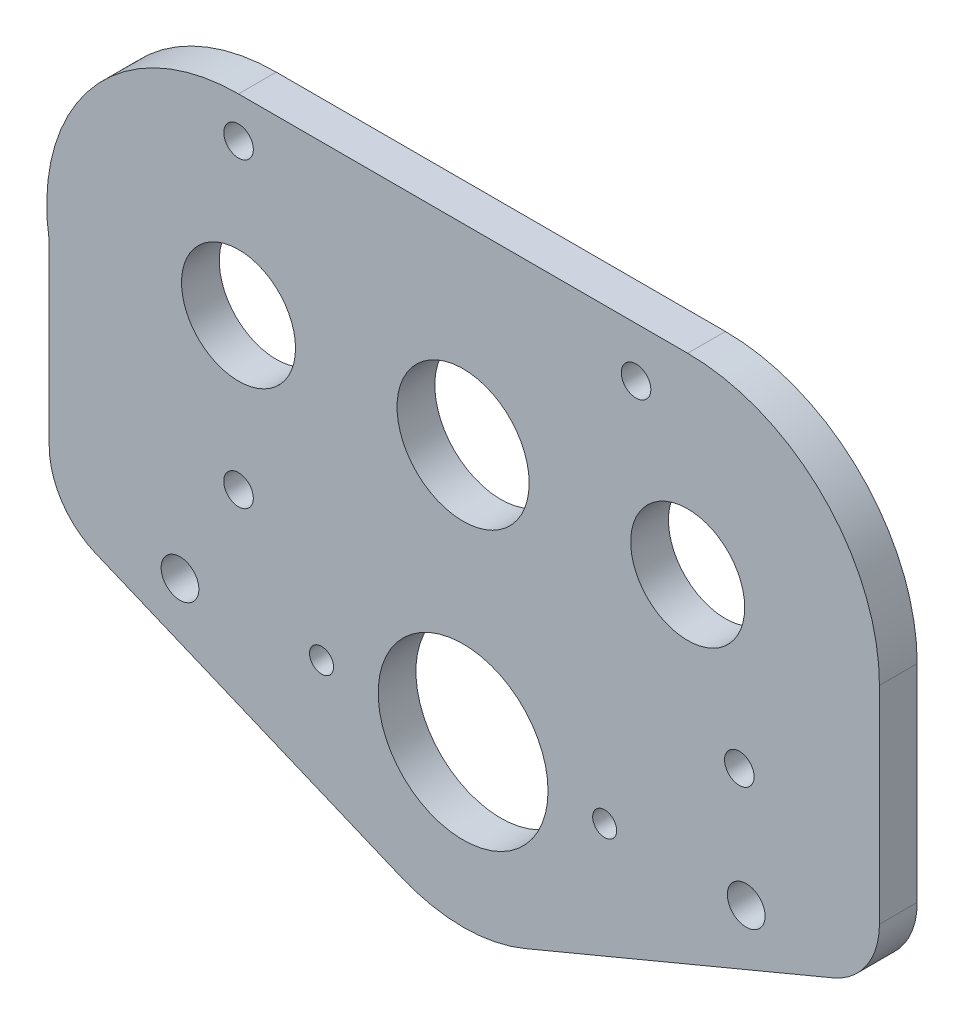
ISO-10303-21;
HEADER;
FILE_DESCRIPTION(('STEP AP214'),'2;1');
FILE_NAME('part.step','',(''),(''),'','','');
FILE_SCHEMA(('AUTOMOTIVE_DESIGN { 1 0 10303 214 1 1 1 1 }'));
ENDSEC;
DATA;
#1=APPLICATION_CONTEXT('core data for automotive mechanical design processes');
#2=APPLICATION_PROTOCOL_DEFINITION('international standard','automotive_design',2000,#1);
#3=PRODUCT_CONTEXT('',#1,'mechanical');
#4=PRODUCT('Part','Part','',(#3));
#5=PRODUCT_RELATED_PRODUCT_CATEGORY('part','',(#4));
#6=PRODUCT_DEFINITION_FORMATION('','',#4);
#7=PRODUCT_DEFINITION_CONTEXT('part definition',#1,'design');
#8=PRODUCT_DEFINITION('design','',#6,#7);
#9=PRODUCT_DEFINITION_SHAPE('','',#8);
#10=(LENGTH_UNIT() NAMED_UNIT(*) SI_UNIT(.MILLI.,.METRE.));
#11=(NAMED_UNIT(*) PLANE_ANGLE_UNIT() SI_UNIT($,.RADIAN.));
#12=(NAMED_UNIT(*) SI_UNIT($,.STERADIAN.) SOLID_ANGLE_UNIT());
#13=UNCERTAINTY_MEASURE_WITH_UNIT(LENGTH_MEASURE(1.E-05),#10,'distance_accuracy_value','');
#14=(GEOMETRIC_REPRESENTATION_CONTEXT(3) GLOBAL_UNCERTAINTY_ASSIGNED_CONTEXT((#13)) GLOBAL_UNIT_ASSIGNED_CONTEXT((#10,
#11,#12)) REPRESENTATION_CONTEXT('',''));
#15=CARTESIAN_POINT('',(0.,0.,0.));
#16=DIRECTION('',(0.,0.,1.));
#17=DIRECTION('',(1.,0.,0.));
#18=AXIS2_PLACEMENT_3D('',#15,#16,#17);
#19=CARTESIAN_POINT('',(-37.7793249999999,43.2562,3.175));
#20=DIRECTION('',(0.,0.,-1.));
#21=DIRECTION('',(-1.,0.,0.));
#22=AXIS2_PLACEMENT_3D('',#19,#20,#21);
#23=PLANE('',#22);
#24=CARTESIAN_POINT('',(46.4666366404921,19.3880074320415,3.175));
#25=DIRECTION('',(0.,0.,1.));
#26=DIRECTION('',(1.,0.,0.));
#27=AXIS2_PLACEMENT_3D('',#24,#25,#26);
#28=CIRCLE('',#27,2.4892);
#29=CARTESIAN_POINT('',(48.9558366404922,19.3880074320415,3.175));
#30=VERTEX_POINT('',#29);
#31=EDGE_CURVE('E266',#30,#30,#28,.T.);
#32=ORIENTED_EDGE('',*,*,#31,.F.);
#33=EDGE_LOOP('',(#32));
#34=FACE_BOUND('',#33,.T.);
#35=CARTESIAN_POINT('',(-37.7793249999999,68.6562,3.175));
#36=DIRECTION('',(0.,0.,1.));
#37=DIRECTION('',(1.,0.,0.));
#38=AXIS2_PLACEMENT_3D('',#35,#36,#37);
#39=CIRCLE('',#38,2.4892);
#40=CARTESIAN_POINT('',(-35.2901249999999,68.6562,3.175));
#41=VERTEX_POINT('',#40);
#42=EDGE_CURVE('E254',#41,#41,#39,.T.);
#43=ORIENTED_EDGE('',*,*,#42,.F.);
#44=EDGE_LOOP('',(#43));
#45=FACE_BOUND('',#44,.T.);
#46=CARTESIAN_POINT('',(-23.8125,0.,3.175));
#47=DIRECTION('',(0.,0.,1.));
#48=DIRECTION('',(1.,0.,0.));
#49=AXIS2_PLACEMENT_3D('',#46,#47,#48);
#50=CIRCLE('',#49,2.0193);
#51=CARTESIAN_POINT('',(-21.7932,0.,3.175));
#52=VERTEX_POINT('',#51);
#53=EDGE_CURVE('E242',#52,#52,#50,.T.);
#54=ORIENTED_EDGE('',*,*,#53,.F.);
#55=EDGE_LOOP('',(#54));
#56=FACE_BOUND('',#55,.T.);
#57=CARTESIAN_POINT('',(-47.625,0.,3.175));
#58=DIRECTION('',(0.,0.,1.));
#59=DIRECTION('',(1.,0.,0.));
#60=AXIS2_PLACEMENT_3D('',#57,#58,#59);
#61=CIRCLE('',#60,3.175);
#62=CARTESIAN_POINT('',(-44.45,0.,3.175));
#63=VERTEX_POINT('',#62);
#64=EDGE_CURVE('E230',#63,#63,#61,.T.);
#65=ORIENTED_EDGE('',*,*,#64,.F.);
#66=EDGE_LOOP('',(#65));
#67=FACE_BOUND('',#66,.T.);
#68=CARTESIAN_POINT('',(37.779325,43.2562,3.175));
#69=DIRECTION('',(0.,0.,1.));
#70=DIRECTION('',(1.,0.,0.));
#71=AXIS2_PLACEMENT_3D('',#68,#69,#70);
#72=CIRCLE('',#71,9.5885);
#73=CARTESIAN_POINT('',(47.367825,43.2562,3.175));
#74=VERTEX_POINT('',#73);
#75=EDGE_CURVE('E218',#74,#74,#72,.T.);
#76=ORIENTED_EDGE('',*,*,#75,.F.);
#77=EDGE_LOOP('',(#76));
#78=FACE_BOUND('',#77,.T.);
#79=CARTESIAN_POINT('',(0.,0.,3.175));
#80=DIRECTION('',(0.,0.,1.));
#81=DIRECTION('',(1.,0.,0.));
#82=AXIS2_PLACEMENT_3D('',#79,#80,#81);
#83=CIRCLE('',#82,14.2875);
#84=CARTESIAN_POINT('',(14.2875,0.,3.175));
#85=VERTEX_POINT('',#84);
#86=EDGE_CURVE('E146',#85,#85,#83,.T.);
#87=ORIENTED_EDGE('',*,*,#86,.F.);
#88=EDGE_LOOP('',(#87));
#89=FACE_BOUND('',#88,.T.);
#90=CARTESIAN_POINT('',(-37.7793249999999,43.2562,3.175));
#91=DIRECTION('',(0.,0.,1.));
#92=DIRECTION('',(-1.,0.,0.));
#93=AXIS2_PLACEMENT_3D('',#90,#91,#92);
#94=CIRCLE('',#93,32.258);
#95=CARTESIAN_POINT('',(-37.779325,75.5142,3.175));
#96=VERTEX_POINT('',#95);
#97=CARTESIAN_POINT('',(-69.6225686406845,38.1,3.175));
#98=VERTEX_POINT('',#97);
#99=EDGE_CURVE('E161',#96,#98,#94,.T.);
#100=ORIENTED_EDGE('',*,*,#99,.T.);
#101=DIRECTION('',(0.,-1.,0.));
#102=VECTOR('',#101,1.);
#103=CARTESIAN_POINT('',(-69.6225686406845,38.1,3.175));
#104=LINE('',#103,#102);
#105=CARTESIAN_POINT('',(-69.6225686406845,8.2865313172234,3.175));
#106=VERTEX_POINT('',#105);
#107=EDGE_CURVE('E99',#98,#106,#104,.T.);
#108=ORIENTED_EDGE('',*,*,#107,.T.);
#109=CARTESIAN_POINT('',(-56.9225686406845,8.28653131722333,3.175));
#110=DIRECTION('',(0.,0.,1.));
#111=DIRECTION('',(-1.,0.,0.));
#112=AXIS2_PLACEMENT_3D('',#109,#110,#111);
#113=CIRCLE('',#112,12.7);
#114=CARTESIAN_POINT('',(-61.8162937970207,-3.43274571227991,3.175));
#115=VERTEX_POINT('',#114);
#116=EDGE_CURVE('E182',#106,#115,#113,.T.);
#117=ORIENTED_EDGE('',*,*,#116,.T.);
#118=DIRECTION('',(0.922777718858521,-0.385332689475295,0.));
#119=VECTOR('',#118,1.);
#120=CARTESIAN_POINT('',(-61.8162937970207,-3.43274571227991,3.175));
#121=LINE('',#120,#119);
#122=CARTESIAN_POINT('',(-10.3991659572145,-24.9034636876944,3.175));
#123=VERTEX_POINT('',#122);
#124=EDGE_CURVE('E201',#115,#123,#121,.T.);
#125=ORIENTED_EDGE('',*,*,#124,.T.);
#126=CARTESIAN_POINT('',(0.,1.42247325030098E-13,3.175));
#127=DIRECTION('',(0.,0.,1.));
#128=DIRECTION('',(1.,0.,0.));
#129=AXIS2_PLACEMENT_3D('',#126,#127,#128);
#130=CIRCLE('',#129,26.9875000000001);
#131=CARTESIAN_POINT('',(10.3990857480341,-24.9034971812199,3.175));
#132=VERTEX_POINT('',#131);
#133=EDGE_CURVE('E198',#123,#132,#130,.T.);
#134=ORIENTED_EDGE('',*,*,#133,.T.);
#135=DIRECTION('',(0.922778959934044,0.385329717388946,0.));
#136=VECTOR('',#135,1.);
#137=CARTESIAN_POINT('',(62.2310124108396,-3.25976393644494,3.175));
#138=LINE('',#137,#136);
#139=CARTESIAN_POINT('',(62.2310124108396,-3.25976393644495,3.175));
#140=VERTEX_POINT('',#139);
#141=EDGE_CURVE('E200',#132,#140,#138,.T.);
#142=ORIENTED_EDGE('',*,*,#141,.T.);
#143=CARTESIAN_POINT('',(57.337325,8.45952885471743,3.175));
#144=DIRECTION('',(0.,0.,1.));
#145=DIRECTION('',(-1.,0.,0.));
#146=AXIS2_PLACEMENT_3D('',#143,#144,#145);
#147=CIRCLE('',#146,12.7);
#148=CARTESIAN_POINT('',(70.037325,8.45952885471751,3.175));
#149=VERTEX_POINT('',#148);
#150=EDGE_CURVE('E124',#140,#149,#147,.T.);
#151=ORIENTED_EDGE('',*,*,#150,.T.);
#152=DIRECTION('',(0.,1.,0.));
#153=VECTOR('',#152,1.);
#154=CARTESIAN_POINT('',(70.037325,43.2562,3.175));
#155=LINE('',#154,#153);
#156=CARTESIAN_POINT('',(70.037325,43.2562,3.175));
#157=VERTEX_POINT('',#156);
#158=EDGE_CURVE('E118',#149,#157,#155,.T.);
#159=ORIENTED_EDGE('',*,*,#158,.T.);
#160=CARTESIAN_POINT('',(37.779325,43.2562,3.175));
#161=DIRECTION('',(0.,0.,1.));
#162=DIRECTION('',(-1.,0.,0.));
#163=AXIS2_PLACEMENT_3D('',#160,#161,#162);
#164=CIRCLE('',#163,32.258);
#165=CARTESIAN_POINT('',(37.779325,75.5142,3.175));
#166=VERTEX_POINT('',#165);
#167=EDGE_CURVE('E122',#157,#166,#164,.T.);
#168=ORIENTED_EDGE('',*,*,#167,.T.);
#169=DIRECTION('',(-1.,0.,0.));
#170=VECTOR('',#169,1.);
#171=CARTESIAN_POINT('',(-37.779325,75.5142,3.175));
#172=LINE('',#171,#170);
#173=EDGE_CURVE('E50',#166,#96,#172,.T.);
#174=ORIENTED_EDGE('',*,*,#173,.T.);
#175=EDGE_LOOP('',(#100,#108,#117,#125,#134,#142,#151,#159,#168,#174));
#176=FACE_BOUND('',#175,.T.);
#177=CARTESIAN_POINT('',(-37.779325,43.2562,3.175));
#178=DIRECTION('',(0.,0.,1.));
#179=DIRECTION('',(1.,0.,0.));
#180=AXIS2_PLACEMENT_3D('',#177,#178,#179);
#181=CIRCLE('',#180,9.5885);
#182=CARTESIAN_POINT('',(-28.190825,43.2562,3.175));
#183=VERTEX_POINT('',#182);
#184=EDGE_CURVE('E212',#183,#183,#181,.T.);
#185=ORIENTED_EDGE('',*,*,#184,.F.);
#186=EDGE_LOOP('',(#185));
#187=FACE_BOUND('',#186,.T.);
#188=CARTESIAN_POINT('',(0.,43.2562,3.175));
#189=DIRECTION('',(0.,0.,1.));
#190=DIRECTION('',(1.,0.,0.));
#191=AXIS2_PLACEMENT_3D('',#188,#189,#190);
#192=CIRCLE('',#191,11.1125);
#193=CARTESIAN_POINT('',(11.1125,43.2562,3.175));
#194=VERTEX_POINT('',#193);
#195=EDGE_CURVE('E224',#194,#194,#192,.T.);
#196=ORIENTED_EDGE('',*,*,#195,.F.);
#197=EDGE_LOOP('',(#196));
#198=FACE_BOUND('',#197,.T.);
#199=CARTESIAN_POINT('',(47.625,0.,3.175));
#200=DIRECTION('',(0.,0.,1.));
#201=DIRECTION('',(1.,0.,0.));
#202=AXIS2_PLACEMENT_3D('',#199,#200,#201);
#203=CIRCLE('',#202,3.175);
#204=CARTESIAN_POINT('',(50.8,0.,3.175));
#205=VERTEX_POINT('',#204);
#206=EDGE_CURVE('E236',#205,#205,#203,.T.);
#207=ORIENTED_EDGE('',*,*,#206,.F.);
#208=EDGE_LOOP('',(#207));
#209=FACE_BOUND('',#208,.T.);
#210=CARTESIAN_POINT('',(23.8125,0.,3.175));
#211=DIRECTION('',(0.,0.,1.));
#212=DIRECTION('',(1.,0.,0.));
#213=AXIS2_PLACEMENT_3D('',#210,#211,#212);
#214=CIRCLE('',#213,2.0193);
#215=CARTESIAN_POINT('',(25.8318,0.,3.175));
#216=VERTEX_POINT('',#215);
#217=EDGE_CURVE('E248',#216,#216,#214,.T.);
#218=ORIENTED_EDGE('',*,*,#217,.F.);
#219=EDGE_LOOP('',(#218));
#220=FACE_BOUND('',#219,.T.);
#221=CARTESIAN_POINT('',(-37.7793249999999,17.8562,3.175));
#222=DIRECTION('',(0.,0.,1.));
#223=DIRECTION('',(1.,0.,0.));
#224=AXIS2_PLACEMENT_3D('',#221,#222,#223);
#225=CIRCLE('',#224,2.4892);
#226=CARTESIAN_POINT('',(-35.2901249999999,17.8562,3.175));
#227=VERTEX_POINT('',#226);
#228=EDGE_CURVE('E260',#227,#227,#225,.T.);
#229=ORIENTED_EDGE('',*,*,#228,.F.);
#230=EDGE_LOOP('',(#229));
#231=FACE_BOUND('',#230,.T.);
#232=CARTESIAN_POINT('',(29.0920133595289,67.1243925679586,3.175));
#233=DIRECTION('',(0.,0.,1.));
#234=DIRECTION('',(1.,0.,0.));
#235=AXIS2_PLACEMENT_3D('',#232,#233,#234);
#236=CIRCLE('',#235,2.4892);
#237=CARTESIAN_POINT('',(31.5812133595289,67.1243925679586,3.175));
#238=VERTEX_POINT('',#237);
#239=EDGE_CURVE('E272',#238,#238,#236,.T.);
#240=ORIENTED_EDGE('',*,*,#239,.F.);
#241=EDGE_LOOP('',(#240));
#242=FACE_BOUND('',#241,.T.);
#243=ADVANCED_FACE('F33',(#34,#45,#56,#67,#78,#89,#176,#187,#198,#209,#220,#231,#242),#23,.F.);
#244=CARTESIAN_POINT('',(-37.7793249999999,43.2562,-3.175));
#245=DIRECTION('',(0.,0.,-1.));
#246=DIRECTION('',(-1.,0.,0.));
#247=AXIS2_PLACEMENT_3D('',#244,#245,#246);
#248=PLANE('',#247);
#249=CARTESIAN_POINT('',(46.4666366404921,19.3880074320415,-3.175));
#250=DIRECTION('',(0.,0.,1.));
#251=DIRECTION('',(1.,0.,0.));
#252=AXIS2_PLACEMENT_3D('',#249,#250,#251);
#253=CIRCLE('',#252,2.4892);
#254=CARTESIAN_POINT('',(48.9558366404922,19.3880074320415,-3.175));
#255=VERTEX_POINT('',#254);
#256=EDGE_CURVE('E269',#255,#255,#253,.T.);
#257=ORIENTED_EDGE('',*,*,#256,.T.);
#258=EDGE_LOOP('',(#257));
#259=FACE_BOUND('',#258,.T.);
#260=CARTESIAN_POINT('',(-37.7793249999999,68.6562,-3.175));
#261=DIRECTION('',(0.,0.,1.));
#262=DIRECTION('',(1.,0.,0.));
#263=AXIS2_PLACEMENT_3D('',#260,#261,#262);
#264=CIRCLE('',#263,2.4892);
#265=CARTESIAN_POINT('',(-35.2901249999999,68.6562,-3.175));
#266=VERTEX_POINT('',#265);
#267=EDGE_CURVE('E257',#266,#266,#264,.T.);
#268=ORIENTED_EDGE('',*,*,#267,.T.);
#269=EDGE_LOOP('',(#268));
#270=FACE_BOUND('',#269,.T.);
#271=CARTESIAN_POINT('',(-23.8125,0.,-3.175));
#272=DIRECTION('',(0.,0.,1.));
#273=DIRECTION('',(1.,0.,0.));
#274=AXIS2_PLACEMENT_3D('',#271,#272,#273);
#275=CIRCLE('',#274,2.0193);
#276=CARTESIAN_POINT('',(-21.7932,0.,-3.175));
#277=VERTEX_POINT('',#276);
#278=EDGE_CURVE('E245',#277,#277,#275,.T.);
#279=ORIENTED_EDGE('',*,*,#278,.T.);
#280=EDGE_LOOP('',(#279));
#281=FACE_BOUND('',#280,.T.);
#282=CARTESIAN_POINT('',(-47.625,0.,-3.175));
#283=DIRECTION('',(0.,0.,1.));
#284=DIRECTION('',(1.,0.,0.));
#285=AXIS2_PLACEMENT_3D('',#282,#283,#284);
#286=CIRCLE('',#285,3.175);
#287=CARTESIAN_POINT('',(-44.45,0.,-3.175));
#288=VERTEX_POINT('',#287);
#289=EDGE_CURVE('E233',#288,#288,#286,.T.);
#290=ORIENTED_EDGE('',*,*,#289,.T.);
#291=EDGE_LOOP('',(#290));
#292=FACE_BOUND('',#291,.T.);
#293=CARTESIAN_POINT('',(37.779325,43.2562,-3.175));
#294=DIRECTION('',(0.,0.,1.));
#295=DIRECTION('',(1.,0.,0.));
#296=AXIS2_PLACEMENT_3D('',#293,#294,#295);
#297=CIRCLE('',#296,9.5885);
#298=CARTESIAN_POINT('',(47.367825,43.2562,-3.175));
#299=VERTEX_POINT('',#298);
#300=EDGE_CURVE('E221',#299,#299,#297,.T.);
#301=ORIENTED_EDGE('',*,*,#300,.T.);
#302=EDGE_LOOP('',(#301));
#303=FACE_BOUND('',#302,.T.);
#304=CARTESIAN_POINT('',(0.,0.,-3.175));
#305=DIRECTION('',(0.,0.,1.));
#306=DIRECTION('',(1.,0.,0.));
#307=AXIS2_PLACEMENT_3D('',#304,#305,#306);
#308=CIRCLE('',#307,14.2875);
#309=CARTESIAN_POINT('',(14.2875,0.,-3.175));
#310=VERTEX_POINT('',#309);
#311=EDGE_CURVE('E209',#310,#310,#308,.T.);
#312=ORIENTED_EDGE('',*,*,#311,.T.);
#313=EDGE_LOOP('',(#312));
#314=FACE_BOUND('',#313,.T.);
#315=CARTESIAN_POINT('',(-37.7793249999999,43.2562,-3.175));
#316=DIRECTION('',(0.,0.,1.));
#317=DIRECTION('',(-1.,0.,0.));
#318=AXIS2_PLACEMENT_3D('',#315,#316,#317);
#319=CIRCLE('',#318,32.258);
#320=CARTESIAN_POINT('',(-37.779325,75.5142,-3.175));
#321=VERTEX_POINT('',#320);
#322=CARTESIAN_POINT('',(-69.6225686406845,38.1,-3.175));
#323=VERTEX_POINT('',#322);
#324=EDGE_CURVE('E142',#321,#323,#319,.T.);
#325=ORIENTED_EDGE('',*,*,#324,.F.);
#326=DIRECTION('',(-1.,0.,0.));
#327=VECTOR('',#326,1.);
#328=CARTESIAN_POINT('',(-37.779325,75.5142,-3.175));
#329=LINE('',#328,#327);
#330=CARTESIAN_POINT('',(37.779325,75.5142,-3.175));
#331=VERTEX_POINT('',#330);
#332=EDGE_CURVE('E91',#331,#321,#329,.T.);
#333=ORIENTED_EDGE('',*,*,#332,.F.);
#334=CARTESIAN_POINT('',(37.779325,43.2562,-3.175));
#335=DIRECTION('',(0.,0.,1.));
#336=DIRECTION('',(-1.,0.,0.));
#337=AXIS2_PLACEMENT_3D('',#334,#335,#336);
#338=CIRCLE('',#337,32.258);
#339=CARTESIAN_POINT('',(70.037325,43.2562,-3.175));
#340=VERTEX_POINT('',#339);
#341=EDGE_CURVE('E85',#340,#331,#338,.T.);
#342=ORIENTED_EDGE('',*,*,#341,.F.);
#343=DIRECTION('',(0.,1.,0.));
#344=VECTOR('',#343,1.);
#345=CARTESIAN_POINT('',(70.037325,43.2562,-3.175));
#346=LINE('',#345,#344);
#347=CARTESIAN_POINT('',(70.037325,8.45952885471751,-3.175));
#348=VERTEX_POINT('',#347);
#349=EDGE_CURVE('E132',#348,#340,#346,.T.);
#350=ORIENTED_EDGE('',*,*,#349,.F.);
#351=CARTESIAN_POINT('',(57.337325,8.45952885471743,-3.175));
#352=DIRECTION('',(0.,0.,1.));
#353=DIRECTION('',(-1.,0.,0.));
#354=AXIS2_PLACEMENT_3D('',#351,#352,#353);
#355=CIRCLE('',#354,12.7);
#356=CARTESIAN_POINT('',(62.2310124108396,-3.25976393644495,-3.175));
#357=VERTEX_POINT('',#356);
#358=EDGE_CURVE('E156',#357,#348,#355,.T.);
#359=ORIENTED_EDGE('',*,*,#358,.F.);
#360=DIRECTION('',(0.922778959934044,0.385329717388946,0.));
#361=VECTOR('',#360,1.);
#362=CARTESIAN_POINT('',(62.2310124108396,-3.25976393644494,-3.175));
#363=LINE('',#362,#361);
#364=CARTESIAN_POINT('',(10.3990857480341,-24.9034971812199,-3.175));
#365=VERTEX_POINT('',#364);
#366=EDGE_CURVE('E154',#365,#357,#363,.T.);
#367=ORIENTED_EDGE('',*,*,#366,.F.);
#368=CARTESIAN_POINT('',(0.,1.42247325030098E-13,-3.175));
#369=DIRECTION('',(0.,0.,1.));
#370=DIRECTION('',(1.,0.,0.));
#371=AXIS2_PLACEMENT_3D('',#368,#369,#370);
#372=CIRCLE('',#371,26.9875000000001);
#373=CARTESIAN_POINT('',(-10.3991659572145,-24.9034636876944,-3.175));
#374=VERTEX_POINT('',#373);
#375=EDGE_CURVE('E152',#374,#365,#372,.T.);
#376=ORIENTED_EDGE('',*,*,#375,.F.);
#377=DIRECTION('',(0.922777718858521,-0.385332689475295,0.));
#378=VECTOR('',#377,1.);
#379=CARTESIAN_POINT('',(-61.8162937970207,-3.43274571227991,-3.175));
#380=LINE('',#379,#378);
#381=CARTESIAN_POINT('',(-61.8162937970207,-3.43274571227991,-3.175));
#382=VERTEX_POINT('',#381);
#383=EDGE_CURVE('E150',#382,#374,#380,.T.);
#384=ORIENTED_EDGE('',*,*,#383,.F.);
#385=CARTESIAN_POINT('',(-56.9225686406845,8.28653131722333,-3.175));
#386=DIRECTION('',(0.,0.,1.));
#387=DIRECTION('',(-1.,0.,0.));
#388=AXIS2_PLACEMENT_3D('',#385,#386,#387);
#389=CIRCLE('',#388,12.7);
#390=CARTESIAN_POINT('',(-69.6225686406845,8.2865313172234,-3.175));
#391=VERTEX_POINT('',#390);
#392=EDGE_CURVE('E148',#391,#382,#389,.T.);
#393=ORIENTED_EDGE('',*,*,#392,.F.);
#394=DIRECTION('',(0.,-1.,0.));
#395=VECTOR('',#394,1.);
#396=CARTESIAN_POINT('',(-69.6225686406845,38.1,-3.175));
#397=LINE('',#396,#395);
#398=EDGE_CURVE('E145',#323,#391,#397,.T.);
#399=ORIENTED_EDGE('',*,*,#398,.F.);
#400=EDGE_LOOP('',(#325,#333,#342,#350,#359,#367,#376,#384,#393,#399));
#401=FACE_BOUND('',#400,.T.);
#402=CARTESIAN_POINT('',(-37.779325,43.2562,-3.175));
#403=DIRECTION('',(0.,0.,1.));
#404=DIRECTION('',(1.,0.,0.));
#405=AXIS2_PLACEMENT_3D('',#402,#403,#404);
#406=CIRCLE('',#405,9.5885);
#407=CARTESIAN_POINT('',(-28.190825,43.2562,-3.175));
#408=VERTEX_POINT('',#407);
#409=EDGE_CURVE('E215',#408,#408,#406,.T.);
#410=ORIENTED_EDGE('',*,*,#409,.T.);
#411=EDGE_LOOP('',(#410));
#412=FACE_BOUND('',#411,.T.);
#413=CARTESIAN_POINT('',(0.,43.2562,-3.175));
#414=DIRECTION('',(0.,0.,1.));
#415=DIRECTION('',(1.,0.,0.));
#416=AXIS2_PLACEMENT_3D('',#413,#414,#415);
#417=CIRCLE('',#416,11.1125);
#418=CARTESIAN_POINT('',(11.1125,43.2562,-3.175));
#419=VERTEX_POINT('',#418);
#420=EDGE_CURVE('E227',#419,#419,#417,.T.);
#421=ORIENTED_EDGE('',*,*,#420,.T.);
#422=EDGE_LOOP('',(#421));
#423=FACE_BOUND('',#422,.T.);
#424=CARTESIAN_POINT('',(47.625,0.,-3.175));
#425=DIRECTION('',(0.,0.,1.));
#426=DIRECTION('',(1.,0.,0.));
#427=AXIS2_PLACEMENT_3D('',#424,#425,#426);
#428=CIRCLE('',#427,3.175);
#429=CARTESIAN_POINT('',(50.8,0.,-3.175));
#430=VERTEX_POINT('',#429);
#431=EDGE_CURVE('E239',#430,#430,#428,.T.);
#432=ORIENTED_EDGE('',*,*,#431,.T.);
#433=EDGE_LOOP('',(#432));
#434=FACE_BOUND('',#433,.T.);
#435=CARTESIAN_POINT('',(23.8125,0.,-3.175));
#436=DIRECTION('',(0.,0.,1.));
#437=DIRECTION('',(1.,0.,0.));
#438=AXIS2_PLACEMENT_3D('',#435,#436,#437);
#439=CIRCLE('',#438,2.0193);
#440=CARTESIAN_POINT('',(25.8318,0.,-3.175));
#441=VERTEX_POINT('',#440);
#442=EDGE_CURVE('E251',#441,#441,#439,.T.);
#443=ORIENTED_EDGE('',*,*,#442,.T.);
#444=EDGE_LOOP('',(#443));
#445=FACE_BOUND('',#444,.T.);
#446=CARTESIAN_POINT('',(-37.7793249999999,17.8562,-3.175));
#447=DIRECTION('',(0.,0.,1.));
#448=DIRECTION('',(1.,0.,0.));
#449=AXIS2_PLACEMENT_3D('',#446,#447,#448);
#450=CIRCLE('',#449,2.4892);
#451=CARTESIAN_POINT('',(-35.2901249999999,17.8562,-3.175));
#452=VERTEX_POINT('',#451);
#453=EDGE_CURVE('E263',#452,#452,#450,.T.);
#454=ORIENTED_EDGE('',*,*,#453,.T.);
#455=EDGE_LOOP('',(#454));
#456=FACE_BOUND('',#455,.T.);
#457=CARTESIAN_POINT('',(29.0920133595289,67.1243925679586,-3.175));
#458=DIRECTION('',(0.,0.,1.));
#459=DIRECTION('',(1.,0.,0.));
#460=AXIS2_PLACEMENT_3D('',#457,#458,#459);
#461=CIRCLE('',#460,2.4892);
#462=CARTESIAN_POINT('',(31.5812133595289,67.1243925679586,-3.175));
#463=VERTEX_POINT('',#462);
#464=EDGE_CURVE('E275',#463,#463,#461,.T.);
#465=ORIENTED_EDGE('',*,*,#464,.T.);
#466=EDGE_LOOP('',(#465));
#467=FACE_BOUND('',#466,.T.);
#468=ADVANCED_FACE('F186',(#259,#270,#281,#292,#303,#314,#401,#412,#423,#434,#445,#456,#467),
#248,.T.);
#469=CARTESIAN_POINT('',(-37.7793249999999,43.2562,3.175));
#470=DIRECTION('',(0.,0.,-1.));
#471=DIRECTION('',(-1.,0.,0.));
#472=AXIS2_PLACEMENT_3D('',#469,#470,#471);
#473=CYLINDRICAL_SURFACE('',#472,32.258);
#474=ORIENTED_EDGE('',*,*,#324,.T.);
#475=DIRECTION('',(0.,0.,-1.));
#476=VECTOR('',#475,1.);
#477=CARTESIAN_POINT('',(-69.6225686406845,38.1,3.175));
#478=LINE('',#477,#476);
#479=EDGE_CURVE('E11',#98,#323,#478,.T.);
#480=ORIENTED_EDGE('',*,*,#479,.F.);
#481=ORIENTED_EDGE('',*,*,#99,.F.);
#482=DIRECTION('',(0.,0.,-1.));
#483=VECTOR('',#482,1.);
#484=CARTESIAN_POINT('',(-37.779325,75.5142,3.175));
#485=LINE('',#484,#483);
#486=EDGE_CURVE('E138',#96,#321,#485,.T.);
#487=ORIENTED_EDGE('',*,*,#486,.T.);
#488=EDGE_LOOP('',(#474,#480,#481,#487));
#489=FACE_BOUND('',#488,.T.);
#490=ADVANCED_FACE('F35',(#489),#473,.T.);
#491=CARTESIAN_POINT('',(-69.6225686406845,38.1,3.175));
#492=DIRECTION('',(1.,0.,0.));
#493=DIRECTION('',(0.,0.,-1.));
#494=AXIS2_PLACEMENT_3D('',#491,#492,#493);
#495=PLANE('',#494);
#496=ORIENTED_EDGE('',*,*,#398,.T.);
#497=DIRECTION('',(0.,0.,-1.));
#498=VECTOR('',#497,1.);
#499=CARTESIAN_POINT('',(-69.6225686406845,8.2865313172234,3.175));
#500=LINE('',#499,#498);
#501=EDGE_CURVE('E42',#106,#391,#500,.T.);
#502=ORIENTED_EDGE('',*,*,#501,.F.);
#503=ORIENTED_EDGE('',*,*,#107,.F.);
#504=ORIENTED_EDGE('',*,*,#479,.T.);
#505=EDGE_LOOP('',(#496,#502,#503,#504));
#506=FACE_BOUND('',#505,.T.);
#507=ADVANCED_FACE('F318',(#506),#495,.F.);
#508=CARTESIAN_POINT('',(-56.9225686406845,8.28653131722333,3.175));
#509=DIRECTION('',(0.,0.,-1.));
#510=DIRECTION('',(-1.,0.,0.));
#511=AXIS2_PLACEMENT_3D('',#508,#509,#510);
#512=CYLINDRICAL_SURFACE('',#511,12.7);
#513=ORIENTED_EDGE('',*,*,#392,.T.);
#514=DIRECTION('',(0.,0.,-1.));
#515=VECTOR('',#514,1.);
#516=CARTESIAN_POINT('',(-61.8162937970207,-3.43274571227991,3.175));
#517=LINE('',#516,#515);
#518=EDGE_CURVE('E174',#115,#382,#517,.T.);
#519=ORIENTED_EDGE('',*,*,#518,.F.);
#520=ORIENTED_EDGE('',*,*,#116,.F.);
#521=ORIENTED_EDGE('',*,*,#501,.T.);
#522=EDGE_LOOP('',(#513,#519,#520,#521));
#523=FACE_BOUND('',#522,.T.);
#524=ADVANCED_FACE('F180',(#523),#512,.T.);
#525=CARTESIAN_POINT('',(-61.8162937970207,-3.43274571227991,3.175));
#526=DIRECTION('',(0.385332689475295,0.922777718858521,0.));
#527=DIRECTION('',(-0.922777718858521,0.385332689475295,0.));
#528=AXIS2_PLACEMENT_3D('',#525,#526,#527);
#529=PLANE('',#528);
#530=ORIENTED_EDGE('',*,*,#383,.T.);
#531=DIRECTION('',(0.,0.,-1.));
#532=VECTOR('',#531,1.);
#533=CARTESIAN_POINT('',(-10.3991659572145,-24.9034636876944,3.175));
#534=LINE('',#533,#532);
#535=EDGE_CURVE('E171',#123,#374,#534,.T.);
#536=ORIENTED_EDGE('',*,*,#535,.F.);
#537=ORIENTED_EDGE('',*,*,#124,.F.);
#538=ORIENTED_EDGE('',*,*,#518,.T.);
#539=EDGE_LOOP('',(#530,#536,#537,#538));
#540=FACE_BOUND('',#539,.T.);
#541=ADVANCED_FACE('F192',(#540),#529,.F.);
#542=CARTESIAN_POINT('',(0.,1.42247325030098E-13,3.175));
#543=DIRECTION('',(0.,0.,-1.));
#544=DIRECTION('',(-1.,0.,0.));
#545=AXIS2_PLACEMENT_3D('',#542,#543,#544);
#546=CYLINDRICAL_SURFACE('',#545,26.9875000000001);
#547=ORIENTED_EDGE('',*,*,#375,.T.);
#548=DIRECTION('',(0.,0.,-1.));
#549=VECTOR('',#548,1.);
#550=CARTESIAN_POINT('',(10.3990857480341,-24.9034971812199,3.175));
#551=LINE('',#550,#549);
#552=EDGE_CURVE('E168',#132,#365,#551,.T.);
#553=ORIENTED_EDGE('',*,*,#552,.F.);
#554=ORIENTED_EDGE('',*,*,#133,.F.);
#555=ORIENTED_EDGE('',*,*,#535,.T.);
#556=EDGE_LOOP('',(#547,#553,#554,#555));
#557=FACE_BOUND('',#556,.T.);
#558=ADVANCED_FACE('F196',(#557),#546,.T.);
#559=CARTESIAN_POINT('',(62.2310124108396,-3.25976393644494,3.175));
#560=DIRECTION('',(-0.385329717388946,0.922778959934044,0.));
#561=DIRECTION('',(-0.922778959934044,-0.385329717388946,0.));
#562=AXIS2_PLACEMENT_3D('',#559,#560,#561);
#563=PLANE('',#562);
#564=ORIENTED_EDGE('',*,*,#366,.T.);
#565=DIRECTION('',(0.,0.,-1.));
#566=VECTOR('',#565,1.);
#567=CARTESIAN_POINT('',(62.2310124108396,-3.25976393644495,3.175));
#568=LINE('',#567,#566);
#569=EDGE_CURVE('E165',#140,#357,#568,.T.);
#570=ORIENTED_EDGE('',*,*,#569,.F.);
#571=ORIENTED_EDGE('',*,*,#141,.F.);
#572=ORIENTED_EDGE('',*,*,#552,.T.);
#573=EDGE_LOOP('',(#564,#570,#571,#572));
#574=FACE_BOUND('',#573,.T.);
#575=ADVANCED_FACE('F308',(#574),#563,.F.);
#576=CARTESIAN_POINT('',(57.337325,8.45952885471743,3.175));
#577=DIRECTION('',(0.,0.,-1.));
#578=DIRECTION('',(-1.,0.,0.));
#579=AXIS2_PLACEMENT_3D('',#576,#577,#578);
#580=CYLINDRICAL_SURFACE('',#579,12.7);
#581=ORIENTED_EDGE('',*,*,#358,.T.);
#582=DIRECTION('',(0.,0.,-1.));
#583=VECTOR('',#582,1.);
#584=CARTESIAN_POINT('',(70.037325,8.45952885471751,3.175));
#585=LINE('',#584,#583);
#586=EDGE_CURVE('E133',#149,#348,#585,.T.);
#587=ORIENTED_EDGE('',*,*,#586,.F.);
#588=ORIENTED_EDGE('',*,*,#150,.F.);
#589=ORIENTED_EDGE('',*,*,#569,.T.);
#590=EDGE_LOOP('',(#581,#587,#588,#589));
#591=FACE_BOUND('',#590,.T.);
#592=ADVANCED_FACE('F305',(#591),#580,.T.);
#593=CARTESIAN_POINT('',(70.037325,43.2562,3.175));
#594=DIRECTION('',(-1.,0.,0.));
#595=DIRECTION('',(0.,-1.,0.));
#596=AXIS2_PLACEMENT_3D('',#593,#594,#595);
#597=PLANE('',#596);
#598=ORIENTED_EDGE('',*,*,#349,.T.);
#599=DIRECTION('',(0.,0.,-1.));
#600=VECTOR('',#599,1.);
#601=CARTESIAN_POINT('',(70.037325,43.2562,3.175));
#602=LINE('',#601,#600);
#603=EDGE_CURVE('E129',#157,#340,#602,.T.);
#604=ORIENTED_EDGE('',*,*,#603,.F.);
#605=ORIENTED_EDGE('',*,*,#158,.F.);
#606=ORIENTED_EDGE('',*,*,#586,.T.);
#607=EDGE_LOOP('',(#598,#604,#605,#606));
#608=FACE_BOUND('',#607,.T.);
#609=ADVANCED_FACE('F130',(#608),#597,.F.);
#610=CARTESIAN_POINT('',(37.779325,43.2562,3.175));
#611=DIRECTION('',(0.,0.,-1.));
#612=DIRECTION('',(-1.,0.,0.));
#613=AXIS2_PLACEMENT_3D('',#610,#611,#612);
#614=CYLINDRICAL_SURFACE('',#613,32.258);
#615=ORIENTED_EDGE('',*,*,#341,.T.);
#616=DIRECTION('',(0.,0.,-1.));
#617=VECTOR('',#616,1.);
#618=CARTESIAN_POINT('',(37.779325,75.5142,3.175));
#619=LINE('',#618,#617);
#620=EDGE_CURVE('E134',#166,#331,#619,.T.);
#621=ORIENTED_EDGE('',*,*,#620,.F.);
#622=ORIENTED_EDGE('',*,*,#167,.F.);
#623=ORIENTED_EDGE('',*,*,#603,.T.);
#624=EDGE_LOOP('',(#615,#621,#622,#623));
#625=FACE_BOUND('',#624,.T.);
#626=ADVANCED_FACE('F136',(#625),#614,.T.);
#627=CARTESIAN_POINT('',(-37.779325,75.5142,3.175));
#628=DIRECTION('',(0.,-1.,0.));
#629=DIRECTION('',(1.,0.,0.));
#630=AXIS2_PLACEMENT_3D('',#627,#628,#629);
#631=PLANE('',#630);
#632=ORIENTED_EDGE('',*,*,#332,.T.);
#633=ORIENTED_EDGE('',*,*,#486,.F.);
#634=ORIENTED_EDGE('',*,*,#173,.F.);
#635=ORIENTED_EDGE('',*,*,#620,.T.);
#636=EDGE_LOOP('',(#632,#633,#634,#635));
#637=FACE_BOUND('',#636,.T.);
#638=ADVANCED_FACE('F298',(#637),#631,.F.);
#639=CARTESIAN_POINT('',(0.,0.,3.175));
#640=DIRECTION('',(0.,0.,-1.));
#641=DIRECTION('',(-1.,0.,0.));
#642=AXIS2_PLACEMENT_3D('',#639,#640,#641);
#643=CYLINDRICAL_SURFACE('',#642,14.2875);
#644=ORIENTED_EDGE('',*,*,#86,.T.);
#645=EDGE_LOOP('',(#644));
#646=FACE_BOUND('',#645,.T.);
#647=ORIENTED_EDGE('',*,*,#311,.F.);
#648=EDGE_LOOP('',(#647));
#649=FACE_BOUND('',#648,.T.);
#650=ADVANCED_FACE('F295',(#646,#649),#643,.F.);
#651=CARTESIAN_POINT('',(-37.779325,43.2562,3.175));
#652=DIRECTION('',(0.,0.,-1.));
#653=DIRECTION('',(-1.,0.,0.));
#654=AXIS2_PLACEMENT_3D('',#651,#652,#653);
#655=CYLINDRICAL_SURFACE('',#654,9.5885);
#656=ORIENTED_EDGE('',*,*,#184,.T.);
#657=EDGE_LOOP('',(#656));
#658=FACE_BOUND('',#657,.T.);
#659=ORIENTED_EDGE('',*,*,#409,.F.);
#660=EDGE_LOOP('',(#659));
#661=FACE_BOUND('',#660,.T.);
#662=ADVANCED_FACE('F394',(#658,#661),#655,.F.);
#663=CARTESIAN_POINT('',(37.779325,43.2562,3.175));
#664=DIRECTION('',(0.,0.,-1.));
#665=DIRECTION('',(-1.,0.,0.));
#666=AXIS2_PLACEMENT_3D('',#663,#664,#665);
#667=CYLINDRICAL_SURFACE('',#666,9.5885);
#668=ORIENTED_EDGE('',*,*,#75,.T.);
#669=EDGE_LOOP('',(#668));
#670=FACE_BOUND('',#669,.T.);
#671=ORIENTED_EDGE('',*,*,#300,.F.);
#672=EDGE_LOOP('',(#671));
#673=FACE_BOUND('',#672,.T.);
#674=ADVANCED_FACE('F402',(#670,#673),#667,.F.);
#675=CARTESIAN_POINT('',(0.,43.2562,3.175));
#676=DIRECTION('',(0.,0.,-1.));
#677=DIRECTION('',(-1.,0.,0.));
#678=AXIS2_PLACEMENT_3D('',#675,#676,#677);
#679=CYLINDRICAL_SURFACE('',#678,11.1125);
#680=ORIENTED_EDGE('',*,*,#195,.T.);
#681=EDGE_LOOP('',(#680));
#682=FACE_BOUND('',#681,.T.);
#683=ORIENTED_EDGE('',*,*,#420,.F.);
#684=EDGE_LOOP('',(#683));
#685=FACE_BOUND('',#684,.T.);
#686=ADVANCED_FACE('F410',(#682,#685),#679,.F.);
#687=CARTESIAN_POINT('',(-47.625,0.,3.175));
#688=DIRECTION('',(0.,0.,-1.));
#689=DIRECTION('',(-1.,0.,0.));
#690=AXIS2_PLACEMENT_3D('',#687,#688,#689);
#691=CYLINDRICAL_SURFACE('',#690,3.175);
#692=ORIENTED_EDGE('',*,*,#64,.T.);
#693=EDGE_LOOP('',(#692));
#694=FACE_BOUND('',#693,.T.);
#695=ORIENTED_EDGE('',*,*,#289,.F.);
#696=EDGE_LOOP('',(#695));
#697=FACE_BOUND('',#696,.T.);
#698=ADVANCED_FACE('F419',(#694,#697),#691,.F.);
#699=CARTESIAN_POINT('',(47.625,0.,3.175));
#700=DIRECTION('',(0.,0.,-1.));
#701=DIRECTION('',(-1.,0.,0.));
#702=AXIS2_PLACEMENT_3D('',#699,#700,#701);
#703=CYLINDRICAL_SURFACE('',#702,3.175);
#704=ORIENTED_EDGE('',*,*,#206,.T.);
#705=EDGE_LOOP('',(#704));
#706=FACE_BOUND('',#705,.T.);
#707=ORIENTED_EDGE('',*,*,#431,.F.);
#708=EDGE_LOOP('',(#707));
#709=FACE_BOUND('',#708,.T.);
#710=ADVANCED_FACE('F428',(#706,#709),#703,.F.);
#711=CARTESIAN_POINT('',(-23.8125,0.,3.175));
#712=DIRECTION('',(0.,0.,-1.));
#713=DIRECTION('',(-1.,0.,0.));
#714=AXIS2_PLACEMENT_3D('',#711,#712,#713);
#715=CYLINDRICAL_SURFACE('',#714,2.0193);
#716=ORIENTED_EDGE('',*,*,#53,.T.);
#717=EDGE_LOOP('',(#716));
#718=FACE_BOUND('',#717,.T.);
#719=ORIENTED_EDGE('',*,*,#278,.F.);
#720=EDGE_LOOP('',(#719));
#721=FACE_BOUND('',#720,.T.);
#722=ADVANCED_FACE('F437',(#718,#721),#715,.F.);
#723=CARTESIAN_POINT('',(23.8125,0.,3.175));
#724=DIRECTION('',(0.,0.,-1.));
#725=DIRECTION('',(-1.,0.,0.));
#726=AXIS2_PLACEMENT_3D('',#723,#724,#725);
#727=CYLINDRICAL_SURFACE('',#726,2.0193);
#728=ORIENTED_EDGE('',*,*,#217,.T.);
#729=EDGE_LOOP('',(#728));
#730=FACE_BOUND('',#729,.T.);
#731=ORIENTED_EDGE('',*,*,#442,.F.);
#732=EDGE_LOOP('',(#731));
#733=FACE_BOUND('',#732,.T.);
#734=ADVANCED_FACE('F446',(#730,#733),#727,.F.);
#735=CARTESIAN_POINT('',(-37.7793249999999,68.6562,3.175));
#736=DIRECTION('',(0.,0.,-1.));
#737=DIRECTION('',(-1.,0.,0.));
#738=AXIS2_PLACEMENT_3D('',#735,#736,#737);
#739=CYLINDRICAL_SURFACE('',#738,2.4892);
#740=ORIENTED_EDGE('',*,*,#42,.T.);
#741=EDGE_LOOP('',(#740));
#742=FACE_BOUND('',#741,.T.);
#743=ORIENTED_EDGE('',*,*,#267,.F.);
#744=EDGE_LOOP('',(#743));
#745=FACE_BOUND('',#744,.T.);
#746=ADVANCED_FACE('F455',(#742,#745),#739,.F.);
#747=CARTESIAN_POINT('',(-37.7793249999999,17.8562,3.175));
#748=DIRECTION('',(0.,0.,-1.));
#749=DIRECTION('',(-1.,0.,0.));
#750=AXIS2_PLACEMENT_3D('',#747,#748,#749);
#751=CYLINDRICAL_SURFACE('',#750,2.4892);
#752=ORIENTED_EDGE('',*,*,#228,.T.);
#753=EDGE_LOOP('',(#752));
#754=FACE_BOUND('',#753,.T.);
#755=ORIENTED_EDGE('',*,*,#453,.F.);
#756=EDGE_LOOP('',(#755));
#757=FACE_BOUND('',#756,.T.);
#758=ADVANCED_FACE('F464',(#754,#757),#751,.F.);
#759=CARTESIAN_POINT('',(46.4666366404921,19.3880074320415,3.175));
#760=DIRECTION('',(0.,0.,-1.));
#761=DIRECTION('',(-1.,0.,0.));
#762=AXIS2_PLACEMENT_3D('',#759,#760,#761);
#763=CYLINDRICAL_SURFACE('',#762,2.4892);
#764=ORIENTED_EDGE('',*,*,#31,.T.);
#765=EDGE_LOOP('',(#764));
#766=FACE_BOUND('',#765,.T.);
#767=ORIENTED_EDGE('',*,*,#256,.F.);
#768=EDGE_LOOP('',(#767));
#769=FACE_BOUND('',#768,.T.);
#770=ADVANCED_FACE('F473',(#766,#769),#763,.F.);
#771=CARTESIAN_POINT('',(29.0920133595289,67.1243925679586,3.175));
#772=DIRECTION('',(0.,0.,-1.));
#773=DIRECTION('',(-1.,0.,0.));
#774=AXIS2_PLACEMENT_3D('',#771,#772,#773);
#775=CYLINDRICAL_SURFACE('',#774,2.4892);
#776=ORIENTED_EDGE('',*,*,#239,.T.);
#777=EDGE_LOOP('',(#776));
#778=FACE_BOUND('',#777,.T.);
#779=ORIENTED_EDGE('',*,*,#464,.F.);
#780=EDGE_LOOP('',(#779));
#781=FACE_BOUND('',#780,.T.);
#782=ADVANCED_FACE('F281',(#778,#781),#775,.F.);
#783=CLOSED_SHELL('',(#243,#468,#490,#507,#524,#541,#558,#575,#592,#609,#626,#638,#650,#662,
#674,#686,#698,#710,#722,#734,#746,#758,#770,#782));
#784=MANIFOLD_SOLID_BREP('B2',#783);
#785=ADVANCED_BREP_SHAPE_REPRESENTATION('',(#18,#784),#14);
#786=SHAPE_DEFINITION_REPRESENTATION(#9,#785);
ENDSEC;
END-ISO-10303-21;
